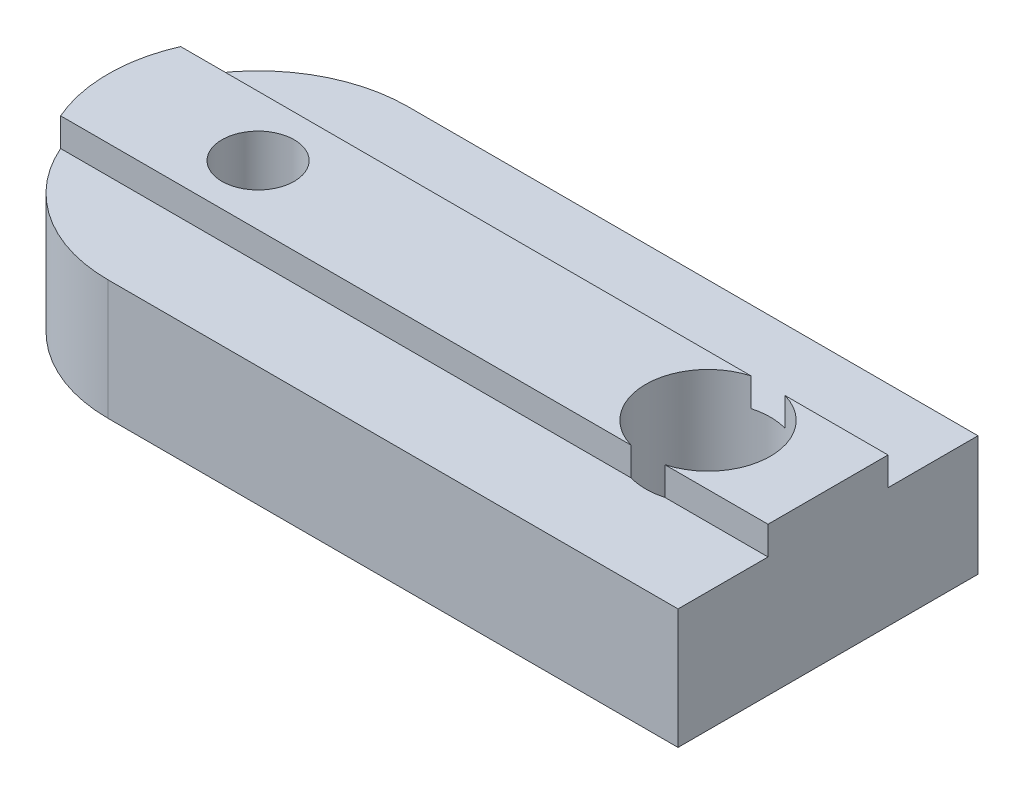
ISO-10303-21;
HEADER;
FILE_DESCRIPTION(('STEP AP214'),'2;1');
FILE_NAME('part.step','',(''),(''),'','','');
FILE_SCHEMA(('AUTOMOTIVE_DESIGN { 1 0 10303 214 1 1 1 1 }'));
ENDSEC;
DATA;
#1=APPLICATION_CONTEXT('core data for automotive mechanical design processes');
#2=APPLICATION_PROTOCOL_DEFINITION('international standard','automotive_design',2000,#1);
#3=PRODUCT_CONTEXT('',#1,'mechanical');
#4=PRODUCT('Part','Part','',(#3));
#5=PRODUCT_RELATED_PRODUCT_CATEGORY('part','',(#4));
#6=PRODUCT_DEFINITION_FORMATION('','',#4);
#7=PRODUCT_DEFINITION_CONTEXT('part definition',#1,'design');
#8=PRODUCT_DEFINITION('design','',#6,#7);
#9=PRODUCT_DEFINITION_SHAPE('','',#8);
#10=(LENGTH_UNIT() NAMED_UNIT(*) SI_UNIT(.MILLI.,.METRE.));
#11=(NAMED_UNIT(*) PLANE_ANGLE_UNIT() SI_UNIT($,.RADIAN.));
#12=(NAMED_UNIT(*) SI_UNIT($,.STERADIAN.) SOLID_ANGLE_UNIT());
#13=UNCERTAINTY_MEASURE_WITH_UNIT(LENGTH_MEASURE(1.E-05),#10,'distance_accuracy_value','');
#14=(GEOMETRIC_REPRESENTATION_CONTEXT(3) GLOBAL_UNCERTAINTY_ASSIGNED_CONTEXT((#13)) GLOBAL_UNIT_ASSIGNED_CONTEXT((#10,
#11,#12)) REPRESENTATION_CONTEXT('',''));
#15=CARTESIAN_POINT('',(0.,0.,0.));
#16=DIRECTION('',(0.,0.,1.));
#17=DIRECTION('',(1.,0.,0.));
#18=AXIS2_PLACEMENT_3D('',#15,#16,#17);
#19=CARTESIAN_POINT('',(-11.1125,-2.96875,0.));
#20=DIRECTION('',(0.,1.,0.));
#21=DIRECTION('',(1.,0.,0.));
#22=AXIS2_PLACEMENT_3D('',#19,#20,#21);
#23=PLANE('',#22);
#24=CARTESIAN_POINT('',(-11.1125,-2.96875,0.));
#25=DIRECTION('',(0.,1.,0.));
#26=DIRECTION('',(0.,0.,-1.));
#27=AXIS2_PLACEMENT_3D('',#24,#25,#26);
#28=CIRCLE('',#27,3.175);
#29=CARTESIAN_POINT('',(-11.1125,-2.96875,-3.175));
#30=VERTEX_POINT('',#29);
#31=CARTESIAN_POINT('',(-11.1125,-2.96875,3.175));
#32=VERTEX_POINT('',#31);
#33=EDGE_CURVE('E40',#30,#32,#28,.T.);
#34=ORIENTED_EDGE('',*,*,#33,.F.);
#35=CARTESIAN_POINT('',(-11.1125,-2.96875,0.));
#36=DIRECTION('',(0.,1.,0.));
#37=DIRECTION('',(0.,0.,-1.));
#38=AXIS2_PLACEMENT_3D('',#35,#36,#37);
#39=CIRCLE('',#38,3.175);
#40=EDGE_CURVE('E174',#32,#30,#39,.T.);
#41=ORIENTED_EDGE('',*,*,#40,.F.);
#42=EDGE_LOOP('',(#34,#41));
#43=FACE_BOUND('',#42,.T.);
#44=CARTESIAN_POINT('',(-11.1125,-2.96875,0.));
#45=DIRECTION('',(0.,1.,0.));
#46=DIRECTION('',(0.,0.,-1.));
#47=AXIS2_PLACEMENT_3D('',#44,#45,#46);
#48=CIRCLE('',#47,1.91135);
#49=CARTESIAN_POINT('',(-11.1125,-2.96875,1.91135));
#50=VERTEX_POINT('',#49);
#51=EDGE_CURVE('E11',#50,#50,#48,.T.);
#52=ORIENTED_EDGE('',*,*,#51,.T.);
#53=EDGE_LOOP('',(#52));
#54=FACE_BOUND('',#53,.T.);
#55=ADVANCED_FACE('F16',(#43,#54),#23,.F.);
#56=CARTESIAN_POINT('',(-11.1125,-3.46875,0.));
#57=DIRECTION('',(0.,1.,0.));
#58=DIRECTION('',(0.,0.,-1.));
#59=AXIS2_PLACEMENT_3D('',#56,#57,#58);
#60=CYLINDRICAL_SURFACE('',#59,3.175);
#61=CARTESIAN_POINT('',(-11.1125,-3.96875,0.));
#62=DIRECTION('',(0.,1.,0.));
#63=DIRECTION('',(0.,0.,-1.));
#64=AXIS2_PLACEMENT_3D('',#61,#62,#63);
#65=CIRCLE('',#64,3.175);
#66=CARTESIAN_POINT('',(-11.1125,-3.96875,-3.175));
#67=VERTEX_POINT('',#66);
#68=CARTESIAN_POINT('',(-11.1125,-3.96875,3.175));
#69=VERTEX_POINT('',#68);
#70=EDGE_CURVE('E251',#67,#69,#65,.T.);
#71=ORIENTED_EDGE('',*,*,#70,.F.);
#72=CARTESIAN_POINT('',(-11.1125,-3.96875,0.));
#73=DIRECTION('',(0.,1.,0.));
#74=DIRECTION('',(0.,0.,-1.));
#75=AXIS2_PLACEMENT_3D('',#72,#73,#74);
#76=CIRCLE('',#75,3.175);
#77=EDGE_CURVE('E199',#69,#67,#76,.T.);
#78=ORIENTED_EDGE('',*,*,#77,.F.);
#79=DIRECTION('',(0.,1.,0.));
#80=VECTOR('',#79,1.);
#81=CARTESIAN_POINT('',(-11.1125,-3.46875,3.175));
#82=LINE('',#81,#80);
#83=EDGE_CURVE('E27',#69,#32,#82,.T.);
#84=ORIENTED_EDGE('',*,*,#83,.T.);
#85=ORIENTED_EDGE('',*,*,#40,.T.);
#86=ORIENTED_EDGE('',*,*,#33,.T.);
#87=ORIENTED_EDGE('',*,*,#83,.F.);
#88=EDGE_LOOP('',(#71,#78,#84,#85,#86,#87));
#89=FACE_BOUND('',#88,.T.);
#90=ADVANCED_FACE('F329',(#89),#60,.F.);
#91=CARTESIAN_POINT('',(-11.1125,0.348750000000008,0.));
#92=DIRECTION('',(0.,1.,0.));
#93=DIRECTION('',(0.,0.,-1.));
#94=AXIS2_PLACEMENT_3D('',#91,#92,#93);
#95=CYLINDRICAL_SURFACE('',#94,1.91135);
#96=ORIENTED_EDGE('',*,*,#51,.F.);
#97=DIRECTION('',(0.,1.,0.));
#98=VECTOR('',#97,1.);
#99=CARTESIAN_POINT('',(-11.1125,0.348750000000009,1.91135));
#100=LINE('',#99,#98);
#101=CARTESIAN_POINT('',(-11.1125,3.88125,1.91135));
#102=VERTEX_POINT('',#101);
#103=EDGE_CURVE('E302',#50,#102,#100,.T.);
#104=ORIENTED_EDGE('',*,*,#103,.T.);
#105=CARTESIAN_POINT('',(-11.1125,3.88125,0.));
#106=DIRECTION('',(0.,-1.,0.));
#107=DIRECTION('',(0.,0.,-1.));
#108=AXIS2_PLACEMENT_3D('',#105,#106,#107);
#109=CIRCLE('',#108,1.91135);
#110=EDGE_CURVE('E285',#102,#102,#109,.T.);
#111=ORIENTED_EDGE('',*,*,#110,.F.);
#112=ORIENTED_EDGE('',*,*,#103,.F.);
#113=EDGE_LOOP('',(#96,#104,#111,#112));
#114=FACE_BOUND('',#113,.T.);
#115=ADVANCED_FACE('F385',(#114),#95,.F.);
#116=CARTESIAN_POINT('',(19.05,2.38125,3.175));
#117=DIRECTION('',(0.,-1.,0.));
#118=DIRECTION('',(0.,0.,-1.));
#119=AXIS2_PLACEMENT_3D('',#116,#117,#118);
#120=PLANE('',#119);
#121=CARTESIAN_POINT('',(12.7,2.38125,0.));
#122=DIRECTION('',(0.,1.,0.));
#123=DIRECTION('',(1.,0.,0.));
#124=AXIS2_PLACEMENT_3D('',#121,#122,#123);
#125=CIRCLE('',#124,3.3);
#126=CARTESIAN_POINT('',(11.8003472892277,2.38125,3.175));
#127=VERTEX_POINT('',#126);
#128=CARTESIAN_POINT('',(13.5996527107723,2.38125,3.175));
#129=VERTEX_POINT('',#128);
#130=EDGE_CURVE('E225',#127,#129,#125,.T.);
#131=ORIENTED_EDGE('',*,*,#130,.F.);
#132=DIRECTION('',(-1.,0.,0.));
#133=VECTOR('',#132,1.);
#134=CARTESIAN_POINT('',(19.05,2.38125,3.175));
#135=LINE('',#134,#133);
#136=CARTESIAN_POINT('',(-18.3873389157424,2.38125,3.175));
#137=VERTEX_POINT('',#136);
#138=EDGE_CURVE('E314',#127,#137,#135,.T.);
#139=ORIENTED_EDGE('',*,*,#138,.T.);
#140=CARTESIAN_POINT('',(-11.1125,2.38125,0.));
#141=DIRECTION('',(0.,-1.,0.));
#142=DIRECTION('',(0.,0.,1.));
#143=AXIS2_PLACEMENT_3D('',#140,#141,#142);
#144=CIRCLE('',#143,7.9375);
#145=CARTESIAN_POINT('',(-11.1125,2.38125,7.9375));
#146=VERTEX_POINT('',#145);
#147=EDGE_CURVE('E143',#146,#137,#144,.T.);
#148=ORIENTED_EDGE('',*,*,#147,.F.);
#149=DIRECTION('',(-1.,0.,0.));
#150=VECTOR('',#149,1.);
#151=CARTESIAN_POINT('',(9.525,2.38125,7.9375));
#152=LINE('',#151,#150);
#153=CARTESIAN_POINT('',(19.05,2.38125,7.9375));
#154=VERTEX_POINT('',#153);
#155=EDGE_CURVE('E138',#154,#146,#152,.T.);
#156=ORIENTED_EDGE('',*,*,#155,.F.);
#157=DIRECTION('',(0.,0.,1.));
#158=VECTOR('',#157,1.);
#159=CARTESIAN_POINT('',(19.05,2.38125,1.5875));
#160=LINE('',#159,#158);
#161=CARTESIAN_POINT('',(19.05,2.38125,3.175));
#162=VERTEX_POINT('',#161);
#163=EDGE_CURVE('E122',#162,#154,#160,.T.);
#164=ORIENTED_EDGE('',*,*,#163,.F.);
#165=DIRECTION('',(-1.,0.,0.));
#166=VECTOR('',#165,1.);
#167=CARTESIAN_POINT('',(19.05,2.38125,3.175));
#168=LINE('',#167,#166);
#169=EDGE_CURVE('E312',#162,#129,#168,.T.);
#170=ORIENTED_EDGE('',*,*,#169,.T.);
#171=EDGE_LOOP('',(#131,#139,#148,#156,#164,#170));
#172=FACE_BOUND('',#171,.T.);
#173=ADVANCED_FACE('F140',(#172),#120,.F.);
#174=CARTESIAN_POINT('',(19.05,3.88125,3.175));
#175=DIRECTION('',(0.,0.,-1.));
#176=DIRECTION('',(0.,-1.,0.));
#177=AXIS2_PLACEMENT_3D('',#174,#175,#176);
#178=PLANE('',#177);
#179=DIRECTION('',(0.,1.,0.));
#180=VECTOR('',#179,1.);
#181=CARTESIAN_POINT('',(13.5996527107723,-3.96875,3.175));
#182=LINE('',#181,#180);
#183=CARTESIAN_POINT('',(13.5996527107723,3.88125,3.175));
#184=VERTEX_POINT('',#183);
#185=EDGE_CURVE('E229',#129,#184,#182,.T.);
#186=ORIENTED_EDGE('',*,*,#185,.F.);
#187=ORIENTED_EDGE('',*,*,#169,.F.);
#188=DIRECTION('',(0.,-1.,0.));
#189=VECTOR('',#188,1.);
#190=CARTESIAN_POINT('',(19.05,1.940625,3.175));
#191=LINE('',#190,#189);
#192=CARTESIAN_POINT('',(19.05,3.88125,3.175));
#193=VERTEX_POINT('',#192);
#194=EDGE_CURVE('E130',#193,#162,#191,.T.);
#195=ORIENTED_EDGE('',*,*,#194,.F.);
#196=DIRECTION('',(-1.,0.,0.));
#197=VECTOR('',#196,1.);
#198=CARTESIAN_POINT('',(19.05,3.88125,3.175));
#199=LINE('',#198,#197);
#200=EDGE_CURVE('E315',#193,#184,#199,.T.);
#201=ORIENTED_EDGE('',*,*,#200,.T.);
#202=EDGE_LOOP('',(#186,#187,#195,#201));
#203=FACE_BOUND('',#202,.T.);
#204=ADVANCED_FACE('F392',(#203),#178,.F.);
#205=CARTESIAN_POINT('',(19.05,3.88125,-3.175));
#206=DIRECTION('',(0.,-1.,0.));
#207=DIRECTION('',(0.,0.,-1.));
#208=AXIS2_PLACEMENT_3D('',#205,#206,#207);
#209=PLANE('',#208);
#210=CARTESIAN_POINT('',(12.7,3.88125,0.));
#211=DIRECTION('',(0.,1.,0.));
#212=DIRECTION('',(1.,0.,0.));
#213=AXIS2_PLACEMENT_3D('',#210,#211,#212);
#214=CIRCLE('',#213,3.3);
#215=CARTESIAN_POINT('',(13.5996527107723,3.88125,-3.175));
#216=VERTEX_POINT('',#215);
#217=EDGE_CURVE('E186',#184,#216,#214,.T.);
#218=ORIENTED_EDGE('',*,*,#217,.F.);
#219=ORIENTED_EDGE('',*,*,#200,.F.);
#220=DIRECTION('',(0.,0.,1.));
#221=VECTOR('',#220,1.);
#222=CARTESIAN_POINT('',(19.05,3.88125,-1.5875));
#223=LINE('',#222,#221);
#224=CARTESIAN_POINT('',(19.05,3.88125,-3.175));
#225=VERTEX_POINT('',#224);
#226=EDGE_CURVE('E270',#225,#193,#223,.T.);
#227=ORIENTED_EDGE('',*,*,#226,.F.);
#228=DIRECTION('',(-1.,0.,0.));
#229=VECTOR('',#228,1.);
#230=CARTESIAN_POINT('',(19.05,3.88125,-3.175));
#231=LINE('',#230,#229);
#232=EDGE_CURVE('E283',#225,#216,#231,.T.);
#233=ORIENTED_EDGE('',*,*,#232,.T.);
#234=EDGE_LOOP('',(#218,#219,#227,#233));
#235=FACE_BOUND('',#234,.T.);
#236=ADVANCED_FACE('F389',(#235),#209,.F.);
#237=CARTESIAN_POINT('',(19.05,2.38125,-3.175));
#238=DIRECTION('',(0.,0.,1.));
#239=DIRECTION('',(1.,0.,0.));
#240=AXIS2_PLACEMENT_3D('',#237,#238,#239);
#241=PLANE('',#240);
#242=DIRECTION('',(0.,-1.,0.));
#243=VECTOR('',#242,1.);
#244=CARTESIAN_POINT('',(13.5996527107723,-3.96875,-3.175));
#245=LINE('',#244,#243);
#246=CARTESIAN_POINT('',(13.5996527107723,2.38125,-3.175));
#247=VERTEX_POINT('',#246);
#248=EDGE_CURVE('E177',#216,#247,#245,.T.);
#249=ORIENTED_EDGE('',*,*,#248,.F.);
#250=ORIENTED_EDGE('',*,*,#232,.F.);
#251=DIRECTION('',(0.,1.,0.));
#252=VECTOR('',#251,1.);
#253=CARTESIAN_POINT('',(19.05,1.190625,-3.175));
#254=LINE('',#253,#252);
#255=CARTESIAN_POINT('',(19.05,2.38125,-3.175));
#256=VERTEX_POINT('',#255);
#257=EDGE_CURVE('E266',#256,#225,#254,.T.);
#258=ORIENTED_EDGE('',*,*,#257,.F.);
#259=DIRECTION('',(-1.,0.,0.));
#260=VECTOR('',#259,1.);
#261=CARTESIAN_POINT('',(19.05,2.38125,-3.175));
#262=LINE('',#261,#260);
#263=EDGE_CURVE('E280',#256,#247,#262,.T.);
#264=ORIENTED_EDGE('',*,*,#263,.T.);
#265=EDGE_LOOP('',(#249,#250,#258,#264));
#266=FACE_BOUND('',#265,.T.);
#267=ADVANCED_FACE('F359',(#266),#241,.F.);
#268=CARTESIAN_POINT('',(19.05,2.38125,-7.9375));
#269=DIRECTION('',(0.,-1.,0.));
#270=DIRECTION('',(0.,0.,-1.));
#271=AXIS2_PLACEMENT_3D('',#268,#269,#270);
#272=PLANE('',#271);
#273=CARTESIAN_POINT('',(12.7,2.38125,0.));
#274=DIRECTION('',(0.,1.,0.));
#275=DIRECTION('',(1.,0.,0.));
#276=AXIS2_PLACEMENT_3D('',#273,#274,#275);
#277=CIRCLE('',#276,3.3);
#278=CARTESIAN_POINT('',(11.8003472892277,2.38125,-3.175));
#279=VERTEX_POINT('',#278);
#280=EDGE_CURVE('E175',#247,#279,#277,.T.);
#281=ORIENTED_EDGE('',*,*,#280,.F.);
#282=ORIENTED_EDGE('',*,*,#263,.F.);
#283=DIRECTION('',(0.,0.,1.));
#284=VECTOR('',#283,1.);
#285=CARTESIAN_POINT('',(19.05,2.38125,-3.96875));
#286=LINE('',#285,#284);
#287=CARTESIAN_POINT('',(19.05,2.38125,-7.9375));
#288=VERTEX_POINT('',#287);
#289=EDGE_CURVE('E265',#288,#256,#286,.T.);
#290=ORIENTED_EDGE('',*,*,#289,.F.);
#291=DIRECTION('',(1.,0.,0.));
#292=VECTOR('',#291,1.);
#293=CARTESIAN_POINT('',(9.525,2.38125,-7.9375));
#294=LINE('',#293,#292);
#295=CARTESIAN_POINT('',(-11.1125,2.38125,-7.9375));
#296=VERTEX_POINT('',#295);
#297=EDGE_CURVE('E197',#296,#288,#294,.T.);
#298=ORIENTED_EDGE('',*,*,#297,.F.);
#299=CARTESIAN_POINT('',(-11.1125,2.38125,0.));
#300=DIRECTION('',(0.,-1.,0.));
#301=DIRECTION('',(0.,0.,1.));
#302=AXIS2_PLACEMENT_3D('',#299,#300,#301);
#303=CIRCLE('',#302,7.9375);
#304=CARTESIAN_POINT('',(-18.3873389157424,2.38125,-3.175));
#305=VERTEX_POINT('',#304);
#306=EDGE_CURVE('E230',#305,#296,#303,.T.);
#307=ORIENTED_EDGE('',*,*,#306,.F.);
#308=DIRECTION('',(-1.,0.,0.));
#309=VECTOR('',#308,1.);
#310=CARTESIAN_POINT('',(19.05,2.38125,-3.175));
#311=LINE('',#310,#309);
#312=EDGE_CURVE('E284',#279,#305,#311,.T.);
#313=ORIENTED_EDGE('',*,*,#312,.F.);
#314=EDGE_LOOP('',(#281,#282,#290,#298,#307,#313));
#315=FACE_BOUND('',#314,.T.);
#316=ADVANCED_FACE('F361',(#315),#272,.F.);
#317=CARTESIAN_POINT('',(19.05,2.38125,-3.175));
#318=DIRECTION('',(0.,0.,1.));
#319=DIRECTION('',(1.,0.,0.));
#320=AXIS2_PLACEMENT_3D('',#317,#318,#319);
#321=PLANE('',#320);
#322=DIRECTION('',(0.,1.,0.));
#323=VECTOR('',#322,1.);
#324=CARTESIAN_POINT('',(11.8003472892277,-3.96875,-3.175));
#325=LINE('',#324,#323);
#326=CARTESIAN_POINT('',(11.8003472892277,3.88125,-3.175));
#327=VERTEX_POINT('',#326);
#328=EDGE_CURVE('E178',#279,#327,#325,.T.);
#329=ORIENTED_EDGE('',*,*,#328,.F.);
#330=ORIENTED_EDGE('',*,*,#312,.T.);
#331=DIRECTION('',(0.,-1.,0.));
#332=VECTOR('',#331,1.);
#333=CARTESIAN_POINT('',(-18.3873389157424,-3.96875,-3.175));
#334=LINE('',#333,#332);
#335=CARTESIAN_POINT('',(-18.3873389157424,3.88125,-3.175));
#336=VERTEX_POINT('',#335);
#337=EDGE_CURVE('E170',#336,#305,#334,.T.);
#338=ORIENTED_EDGE('',*,*,#337,.F.);
#339=DIRECTION('',(-1.,0.,0.));
#340=VECTOR('',#339,1.);
#341=CARTESIAN_POINT('',(19.05,3.88125,-3.175));
#342=LINE('',#341,#340);
#343=EDGE_CURVE('E20',#327,#336,#342,.T.);
#344=ORIENTED_EDGE('',*,*,#343,.F.);
#345=EDGE_LOOP('',(#329,#330,#338,#344));
#346=FACE_BOUND('',#345,.T.);
#347=ADVANCED_FACE('F377',(#346),#321,.F.);
#348=CARTESIAN_POINT('',(19.05,3.88125,-3.175));
#349=DIRECTION('',(0.,-1.,0.));
#350=DIRECTION('',(0.,0.,-1.));
#351=AXIS2_PLACEMENT_3D('',#348,#349,#350);
#352=PLANE('',#351);
#353=CARTESIAN_POINT('',(12.7,3.88125,0.));
#354=DIRECTION('',(0.,1.,0.));
#355=DIRECTION('',(1.,0.,0.));
#356=AXIS2_PLACEMENT_3D('',#353,#354,#355);
#357=CIRCLE('',#356,3.3);
#358=CARTESIAN_POINT('',(9.4,3.88125,0.));
#359=VERTEX_POINT('',#358);
#360=EDGE_CURVE('E165',#327,#359,#357,.T.);
#361=ORIENTED_EDGE('',*,*,#360,.F.);
#362=ORIENTED_EDGE('',*,*,#343,.T.);
#363=CARTESIAN_POINT('',(-11.1125,3.88125,0.));
#364=DIRECTION('',(0.,-1.,0.));
#365=DIRECTION('',(0.,0.,1.));
#366=AXIS2_PLACEMENT_3D('',#363,#364,#365);
#367=CIRCLE('',#366,7.9375);
#368=CARTESIAN_POINT('',(-18.3873389157424,3.88125,3.175));
#369=VERTEX_POINT('',#368);
#370=EDGE_CURVE('E202',#369,#336,#367,.T.);
#371=ORIENTED_EDGE('',*,*,#370,.F.);
#372=DIRECTION('',(-1.,0.,0.));
#373=VECTOR('',#372,1.);
#374=CARTESIAN_POINT('',(19.05,3.88125,3.175));
#375=LINE('',#374,#373);
#376=CARTESIAN_POINT('',(11.8003472892277,3.88125,3.175));
#377=VERTEX_POINT('',#376);
#378=EDGE_CURVE('E148',#377,#369,#375,.T.);
#379=ORIENTED_EDGE('',*,*,#378,.F.);
#380=CARTESIAN_POINT('',(12.7,3.88125,0.));
#381=DIRECTION('',(0.,1.,0.));
#382=DIRECTION('',(1.,0.,0.));
#383=AXIS2_PLACEMENT_3D('',#380,#381,#382);
#384=CIRCLE('',#383,3.3);
#385=EDGE_CURVE('E171',#359,#377,#384,.T.);
#386=ORIENTED_EDGE('',*,*,#385,.F.);
#387=EDGE_LOOP('',(#361,#362,#371,#379,#386));
#388=FACE_BOUND('',#387,.T.);
#389=ORIENTED_EDGE('',*,*,#110,.T.);
#390=EDGE_LOOP('',(#389));
#391=FACE_BOUND('',#390,.T.);
#392=ADVANCED_FACE('F18',(#388,#391),#352,.F.);
#393=CARTESIAN_POINT('',(19.05,3.88125,3.175));
#394=DIRECTION('',(0.,0.,-1.));
#395=DIRECTION('',(0.,-1.,0.));
#396=AXIS2_PLACEMENT_3D('',#393,#394,#395);
#397=PLANE('',#396);
#398=DIRECTION('',(0.,-1.,0.));
#399=VECTOR('',#398,1.);
#400=CARTESIAN_POINT('',(11.8003472892277,-3.96875,3.175));
#401=LINE('',#400,#399);
#402=EDGE_CURVE('E228',#377,#127,#401,.T.);
#403=ORIENTED_EDGE('',*,*,#402,.F.);
#404=ORIENTED_EDGE('',*,*,#378,.T.);
#405=DIRECTION('',(0.,1.,0.));
#406=VECTOR('',#405,1.);
#407=CARTESIAN_POINT('',(-18.3873389157424,-3.96875,3.175));
#408=LINE('',#407,#406);
#409=EDGE_CURVE('E209',#137,#369,#408,.T.);
#410=ORIENTED_EDGE('',*,*,#409,.F.);
#411=ORIENTED_EDGE('',*,*,#138,.F.);
#412=EDGE_LOOP('',(#403,#404,#410,#411));
#413=FACE_BOUND('',#412,.T.);
#414=ADVANCED_FACE('F368',(#413),#397,.F.);
#415=CARTESIAN_POINT('',(0.,3.96875,7.9375));
#416=DIRECTION('',(0.,0.,1.));
#417=DIRECTION('',(1.,0.,0.));
#418=AXIS2_PLACEMENT_3D('',#415,#416,#417);
#419=PLANE('',#418);
#420=ORIENTED_EDGE('',*,*,#155,.T.);
#421=DIRECTION('',(0.,-1.,0.));
#422=VECTOR('',#421,1.);
#423=CARTESIAN_POINT('',(-11.1125,-3.96875,7.9375));
#424=LINE('',#423,#422);
#425=CARTESIAN_POINT('',(-11.1125,-3.96875,7.9375));
#426=VERTEX_POINT('',#425);
#427=EDGE_CURVE('E149',#146,#426,#424,.T.);
#428=ORIENTED_EDGE('',*,*,#427,.T.);
#429=DIRECTION('',(1.,0.,0.));
#430=VECTOR('',#429,1.);
#431=CARTESIAN_POINT('',(0.,-3.96875,7.9375));
#432=LINE('',#431,#430);
#433=CARTESIAN_POINT('',(19.05,-3.96875,7.9375));
#434=VERTEX_POINT('',#433);
#435=EDGE_CURVE('E152',#426,#434,#432,.T.);
#436=ORIENTED_EDGE('',*,*,#435,.T.);
#437=DIRECTION('',(0.,-1.,0.));
#438=VECTOR('',#437,1.);
#439=CARTESIAN_POINT('',(19.05,3.96875,7.9375));
#440=LINE('',#439,#438);
#441=EDGE_CURVE('E127',#154,#434,#440,.T.);
#442=ORIENTED_EDGE('',*,*,#441,.F.);
#443=EDGE_LOOP('',(#420,#428,#436,#442));
#444=FACE_BOUND('',#443,.T.);
#445=ADVANCED_FACE('F151',(#444),#419,.T.);
#446=CARTESIAN_POINT('',(-11.1125,-3.96875,0.));
#447=DIRECTION('',(0.,1.,0.));
#448=DIRECTION('',(0.,0.,1.));
#449=AXIS2_PLACEMENT_3D('',#446,#447,#448);
#450=CYLINDRICAL_SURFACE('',#449,7.9375);
#451=ORIENTED_EDGE('',*,*,#306,.T.);
#452=DIRECTION('',(0.,-1.,0.));
#453=VECTOR('',#452,1.);
#454=CARTESIAN_POINT('',(-11.1125,-3.96875,-7.9375));
#455=LINE('',#454,#453);
#456=CARTESIAN_POINT('',(-11.1125,-3.96875,-7.9375));
#457=VERTEX_POINT('',#456);
#458=EDGE_CURVE('E220',#296,#457,#455,.T.);
#459=ORIENTED_EDGE('',*,*,#458,.T.);
#460=CARTESIAN_POINT('',(-11.1125,-3.96875,0.));
#461=DIRECTION('',(0.,-1.,0.));
#462=DIRECTION('',(0.,0.,1.));
#463=AXIS2_PLACEMENT_3D('',#460,#461,#462);
#464=CIRCLE('',#463,7.9375);
#465=EDGE_CURVE('E242',#426,#457,#464,.T.);
#466=ORIENTED_EDGE('',*,*,#465,.F.);
#467=ORIENTED_EDGE('',*,*,#427,.F.);
#468=ORIENTED_EDGE('',*,*,#147,.T.);
#469=ORIENTED_EDGE('',*,*,#409,.T.);
#470=ORIENTED_EDGE('',*,*,#370,.T.);
#471=ORIENTED_EDGE('',*,*,#337,.T.);
#472=EDGE_LOOP('',(#451,#459,#466,#467,#468,#469,#470,#471));
#473=FACE_BOUND('',#472,.T.);
#474=ADVANCED_FACE('F241',(#473),#450,.T.);
#475=CARTESIAN_POINT('',(12.7,-3.96875,0.));
#476=DIRECTION('',(0.,1.,0.));
#477=DIRECTION('',(1.,0.,0.));
#478=AXIS2_PLACEMENT_3D('',#475,#476,#477);
#479=CYLINDRICAL_SURFACE('',#478,3.3);
#480=CARTESIAN_POINT('',(12.7,-3.96875,0.));
#481=DIRECTION('',(0.,1.,0.));
#482=DIRECTION('',(1.,0.,0.));
#483=AXIS2_PLACEMENT_3D('',#480,#481,#482);
#484=CIRCLE('',#483,3.3);
#485=CARTESIAN_POINT('',(9.4,-3.96875,0.));
#486=VERTEX_POINT('',#485);
#487=EDGE_CURVE('E135',#486,#486,#484,.T.);
#488=ORIENTED_EDGE('',*,*,#487,.F.);
#489=DIRECTION('',(0.,1.,0.));
#490=VECTOR('',#489,1.);
#491=CARTESIAN_POINT('',(9.4,-3.96875,0.));
#492=LINE('',#491,#490);
#493=EDGE_CURVE('E167',#486,#359,#492,.T.);
#494=ORIENTED_EDGE('',*,*,#493,.T.);
#495=ORIENTED_EDGE('',*,*,#385,.T.);
#496=ORIENTED_EDGE('',*,*,#402,.T.);
#497=ORIENTED_EDGE('',*,*,#130,.T.);
#498=ORIENTED_EDGE('',*,*,#185,.T.);
#499=ORIENTED_EDGE('',*,*,#217,.T.);
#500=ORIENTED_EDGE('',*,*,#248,.T.);
#501=ORIENTED_EDGE('',*,*,#280,.T.);
#502=ORIENTED_EDGE('',*,*,#328,.T.);
#503=ORIENTED_EDGE('',*,*,#360,.T.);
#504=ORIENTED_EDGE('',*,*,#493,.F.);
#505=EDGE_LOOP('',(#488,#494,#495,#496,#497,#498,#499,#500,#501,#502,#503,#504));
#506=FACE_BOUND('',#505,.T.);
#507=ADVANCED_FACE('F402',(#506),#479,.F.);
#508=CARTESIAN_POINT('',(0.,-3.96875,-7.9375));
#509=DIRECTION('',(0.,0.,-1.));
#510=DIRECTION('',(0.,-1.,0.));
#511=AXIS2_PLACEMENT_3D('',#508,#509,#510);
#512=PLANE('',#511);
#513=ORIENTED_EDGE('',*,*,#297,.T.);
#514=DIRECTION('',(0.,1.,0.));
#515=VECTOR('',#514,1.);
#516=CARTESIAN_POINT('',(19.05,-3.96875,-7.9375));
#517=LINE('',#516,#515);
#518=CARTESIAN_POINT('',(19.05,-3.96875,-7.9375));
#519=VERTEX_POINT('',#518);
#520=EDGE_CURVE('E161',#519,#288,#517,.T.);
#521=ORIENTED_EDGE('',*,*,#520,.F.);
#522=DIRECTION('',(1.,0.,0.));
#523=VECTOR('',#522,1.);
#524=CARTESIAN_POINT('',(0.,-3.96875,-7.9375));
#525=LINE('',#524,#523);
#526=EDGE_CURVE('E246',#457,#519,#525,.T.);
#527=ORIENTED_EDGE('',*,*,#526,.F.);
#528=ORIENTED_EDGE('',*,*,#458,.F.);
#529=EDGE_LOOP('',(#513,#521,#527,#528));
#530=FACE_BOUND('',#529,.T.);
#531=ADVANCED_FACE('F247',(#530),#512,.T.);
#532=CARTESIAN_POINT('',(0.,-3.96875,7.9375));
#533=DIRECTION('',(0.,-1.,0.));
#534=DIRECTION('',(-1.,0.,0.));
#535=AXIS2_PLACEMENT_3D('',#532,#533,#534);
#536=PLANE('',#535);
#537=ORIENTED_EDGE('',*,*,#465,.T.);
#538=ORIENTED_EDGE('',*,*,#526,.T.);
#539=DIRECTION('',(0.,0.,-1.));
#540=VECTOR('',#539,1.);
#541=CARTESIAN_POINT('',(19.05,-3.96875,7.9375));
#542=LINE('',#541,#540);
#543=EDGE_CURVE('E155',#434,#519,#542,.T.);
#544=ORIENTED_EDGE('',*,*,#543,.F.);
#545=ORIENTED_EDGE('',*,*,#435,.F.);
#546=EDGE_LOOP('',(#537,#538,#544,#545));
#547=FACE_BOUND('',#546,.T.);
#548=ORIENTED_EDGE('',*,*,#70,.T.);
#549=ORIENTED_EDGE('',*,*,#77,.T.);
#550=EDGE_LOOP('',(#548,#549));
#551=FACE_BOUND('',#550,.T.);
#552=ORIENTED_EDGE('',*,*,#487,.T.);
#553=EDGE_LOOP('',(#552));
#554=FACE_BOUND('',#553,.T.);
#555=ADVANCED_FACE('F326',(#547,#551,#554),#536,.T.);
#556=CARTESIAN_POINT('',(19.05,0.,0.));
#557=DIRECTION('',(1.,0.,0.));
#558=DIRECTION('',(0.,1.,0.));
#559=AXIS2_PLACEMENT_3D('',#556,#557,#558);
#560=PLANE('',#559);
#561=ORIENTED_EDGE('',*,*,#163,.T.);
#562=ORIENTED_EDGE('',*,*,#441,.T.);
#563=ORIENTED_EDGE('',*,*,#543,.T.);
#564=ORIENTED_EDGE('',*,*,#520,.T.);
#565=ORIENTED_EDGE('',*,*,#289,.T.);
#566=ORIENTED_EDGE('',*,*,#257,.T.);
#567=ORIENTED_EDGE('',*,*,#226,.T.);
#568=ORIENTED_EDGE('',*,*,#194,.T.);
#569=EDGE_LOOP('',(#561,#562,#563,#564,#565,#566,#567,#568));
#570=FACE_BOUND('',#569,.T.);
#571=ADVANCED_FACE('F124',(#570),#560,.T.);
#572=CLOSED_SHELL('',(#55,#90,#115,#173,#204,#236,#267,#316,#347,#392,#414,#445,#474,#507,#531,
#555,#571));
#573=MANIFOLD_SOLID_BREP('B1',#572);
#574=ADVANCED_BREP_SHAPE_REPRESENTATION('',(#18,#573),#14);
#575=SHAPE_DEFINITION_REPRESENTATION(#9,#574);
ENDSEC;
END-ISO-10303-21;
